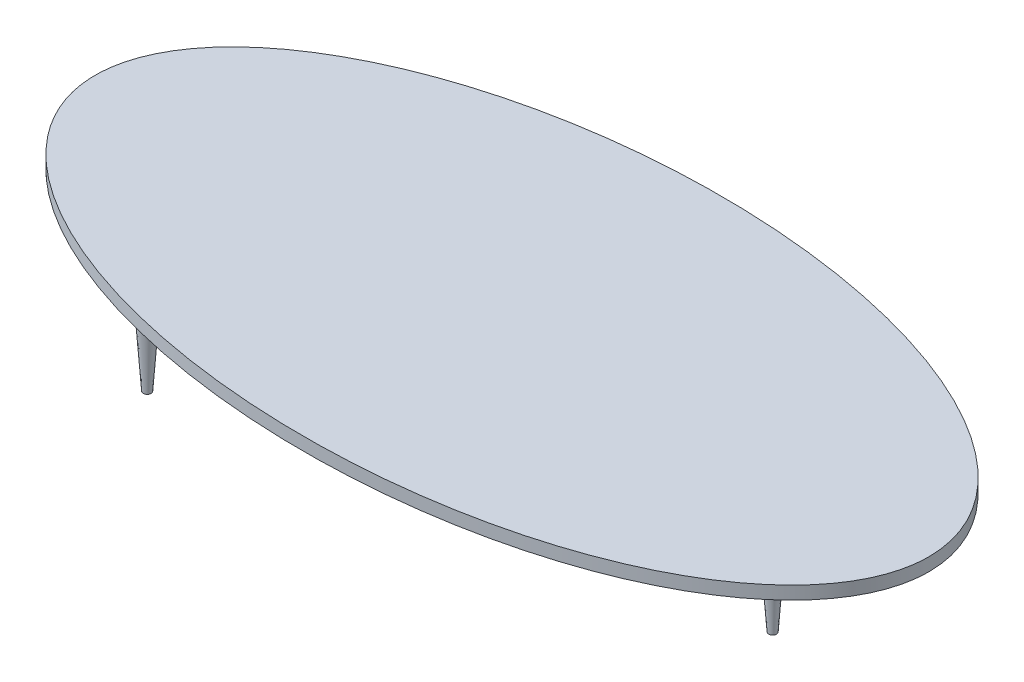
ISO-10303-21;
HEADER;
FILE_DESCRIPTION(('STEP AP214'),'2;1');
FILE_NAME('part.step','',(''),(''),'','','');
FILE_SCHEMA(('AUTOMOTIVE_DESIGN { 1 0 10303 214 1 1 1 1 }'));
ENDSEC;
DATA;
#1=APPLICATION_CONTEXT('core data for automotive mechanical design processes');
#2=APPLICATION_PROTOCOL_DEFINITION('international standard','automotive_design',2000,#1);
#3=PRODUCT_CONTEXT('',#1,'mechanical');
#4=PRODUCT('Part','Part','',(#3));
#5=PRODUCT_RELATED_PRODUCT_CATEGORY('part','',(#4));
#6=PRODUCT_DEFINITION_FORMATION('','',#4);
#7=PRODUCT_DEFINITION_CONTEXT('part definition',#1,'design');
#8=PRODUCT_DEFINITION('design','',#6,#7);
#9=PRODUCT_DEFINITION_SHAPE('','',#8);
#10=(LENGTH_UNIT() NAMED_UNIT(*) SI_UNIT(.MILLI.,.METRE.));
#11=(NAMED_UNIT(*) PLANE_ANGLE_UNIT() SI_UNIT($,.RADIAN.));
#12=(NAMED_UNIT(*) SI_UNIT($,.STERADIAN.) SOLID_ANGLE_UNIT());
#13=UNCERTAINTY_MEASURE_WITH_UNIT(LENGTH_MEASURE(1.E-05),#10,'distance_accuracy_value','');
#14=(GEOMETRIC_REPRESENTATION_CONTEXT(3) GLOBAL_UNCERTAINTY_ASSIGNED_CONTEXT((#13)) GLOBAL_UNIT_ASSIGNED_CONTEXT((#10,
#11,#12)) REPRESENTATION_CONTEXT('',''));
#15=CARTESIAN_POINT('',(0.,0.,0.));
#16=DIRECTION('',(0.,0.,1.));
#17=DIRECTION('',(1.,0.,0.));
#18=AXIS2_PLACEMENT_3D('',#15,#16,#17);
#19=CARTESIAN_POINT('',(0.,76.2,0.));
#20=DIRECTION('',(0.,1.,0.));
#21=DIRECTION('',(1.,0.,0.));
#22=AXIS2_PLACEMENT_3D('',#19,#20,#21);
#23=ELLIPSE('',#22,2438.4,1219.2);
#24=DIRECTION('',(0.,-1.,0.));
#25=VECTOR('',#24,1.);
#26=SURFACE_OF_LINEAR_EXTRUSION('',#23,#25);
#27=CARTESIAN_POINT('',(2438.4,76.2,0.));
#28=VERTEX_POINT('',#27);
#29=EDGE_CURVE('E50',#28,#28,#23,.T.);
#30=ORIENTED_EDGE('',*,*,#29,.F.);
#31=EDGE_LOOP('',(#30));
#32=FACE_BOUND('',#31,.T.);
#33=CARTESIAN_POINT('',(0.,0.,0.));
#34=DIRECTION('',(0.,1.,0.));
#35=DIRECTION('',(1.,0.,0.));
#36=AXIS2_PLACEMENT_3D('',#33,#34,#35);
#37=ELLIPSE('',#36,2438.4,1219.2);
#38=CARTESIAN_POINT('',(2438.4,0.,0.));
#39=VERTEX_POINT('',#38);
#40=EDGE_CURVE('E53',#39,#39,#37,.T.);
#41=ORIENTED_EDGE('',*,*,#40,.T.);
#42=EDGE_LOOP('',(#41));
#43=FACE_BOUND('',#42,.T.);
#44=ADVANCED_FACE('F35',(#32,#43),#26,.F.);
#45=CARTESIAN_POINT('',(0.,76.2,0.));
#46=DIRECTION('',(0.,1.,0.));
#47=DIRECTION('',(0.,0.,1.));
#48=AXIS2_PLACEMENT_3D('',#45,#46,#47);
#49=PLANE('',#48);
#50=ORIENTED_EDGE('',*,*,#29,.T.);
#51=EDGE_LOOP('',(#50));
#52=FACE_BOUND('',#51,.T.);
#53=ADVANCED_FACE('F83',(#52),#49,.T.);
#54=CARTESIAN_POINT('',(0.,0.,0.));
#55=DIRECTION('',(0.,1.,0.));
#56=DIRECTION('',(0.,0.,1.));
#57=AXIS2_PLACEMENT_3D('',#54,#55,#56);
#58=PLANE('',#57);
#59=CARTESIAN_POINT('',(1524.,0.,1.66533453693773E-13));
#60=DIRECTION('',(0.,1.,0.));
#61=DIRECTION('',(0.,0.,1.));
#62=AXIS2_PLACEMENT_3D('',#59,#60,#61);
#63=CIRCLE('',#62,76.2);
#64=CARTESIAN_POINT('',(1524.,0.,-76.1999999999998));
#65=VERTEX_POINT('',#64);
#66=EDGE_CURVE('E10',#65,#65,#63,.F.);
#67=ORIENTED_EDGE('',*,*,#66,.F.);
#68=EDGE_LOOP('',(#67));
#69=FACE_BOUND('',#68,.T.);
#70=CARTESIAN_POINT('',(-1524.,0.,-609.6));
#71=DIRECTION('',(0.,1.,0.));
#72=DIRECTION('',(0.,0.,1.));
#73=AXIS2_PLACEMENT_3D('',#70,#71,#72);
#74=CIRCLE('',#73,76.2);
#75=CARTESIAN_POINT('',(-1524.,0.,-685.8));
#76=VERTEX_POINT('',#75);
#77=EDGE_CURVE('E42',#76,#76,#74,.F.);
#78=ORIENTED_EDGE('',*,*,#77,.F.);
#79=EDGE_LOOP('',(#78));
#80=FACE_BOUND('',#79,.T.);
#81=CARTESIAN_POINT('',(-1524.,0.,609.6));
#82=DIRECTION('',(0.,1.,0.));
#83=DIRECTION('',(0.,0.,1.));
#84=AXIS2_PLACEMENT_3D('',#81,#82,#83);
#85=CIRCLE('',#84,76.2);
#86=CARTESIAN_POINT('',(-1524.,0.,533.4));
#87=VERTEX_POINT('',#86);
#88=EDGE_CURVE('E46',#87,#87,#85,.F.);
#89=ORIENTED_EDGE('',*,*,#88,.F.);
#90=EDGE_LOOP('',(#89));
#91=FACE_BOUND('',#90,.T.);
#92=ORIENTED_EDGE('',*,*,#40,.F.);
#93=EDGE_LOOP('',(#92));
#94=FACE_BOUND('',#93,.T.);
#95=ADVANCED_FACE('F88',(#69,#80,#91,#94),#58,.F.);
#96=CARTESIAN_POINT('',(-1524.,0.,609.6));
#97=DIRECTION('',(0.,1.,0.));
#98=DIRECTION('',(0.,0.,-1.));
#99=AXIS2_PLACEMENT_3D('',#96,#97,#98);
#100=CONICAL_SURFACE('',#99,76.2,0.0698131700797732);
#101=CARTESIAN_POINT('',(-1524.,-762.,609.6));
#102=DIRECTION('',(0.,-1.,0.));
#103=DIRECTION('',(0.,0.,-1.));
#104=AXIS2_PLACEMENT_3D('',#101,#102,#103);
#105=CIRCLE('',#104,22.915769299045);
#106=CARTESIAN_POINT('',(-1524.,-762.,586.684230700955));
#107=VERTEX_POINT('',#106);
#108=EDGE_CURVE('E55',#107,#107,#105,.T.);
#109=CARTESIAN_POINT('',(-1524.,-762.,586.684230700955));
#110=CARTESIAN_POINT('',(-1524.,-754.0625,586.129186631153));
#111=CARTESIAN_POINT('',(-1524.,-746.125,585.574142561352));
#112=CARTESIAN_POINT('',(-1524.,-730.25,584.464054421748));
#113=CARTESIAN_POINT('',(-1524.,-722.3125,583.909010351947));
#114=CARTESIAN_POINT('',(-1524.,-706.4375,582.798922212344));
#115=CARTESIAN_POINT('',(-1524.,-698.5,582.243878142542));
#116=CARTESIAN_POINT('',(-1524.,-682.625,581.133790002939));
#117=CARTESIAN_POINT('',(-1524.,-674.6875,580.578745933137));
#118=CARTESIAN_POINT('',(-1524.,-658.8125,579.468657793534));
#119=CARTESIAN_POINT('',(-1524.,-650.875,578.913613723732));
#120=CARTESIAN_POINT('',(-1524.,-635.,577.803525584129));
#121=CARTESIAN_POINT('',(-1524.,-627.0625,577.248481514327));
#122=CARTESIAN_POINT('',(-1524.,-611.1875,576.138393374724));
#123=CARTESIAN_POINT('',(-1524.,-603.25,575.583349304923));
#124=CARTESIAN_POINT('',(-1524.,-587.375,574.473261165319));
#125=CARTESIAN_POINT('',(-1524.,-579.4375,573.918217095518));
#126=CARTESIAN_POINT('',(-1524.,-563.5625,572.808128955915));
#127=CARTESIAN_POINT('',(-1524.,-555.625,572.253084886113));
#128=CARTESIAN_POINT('',(-1524.,-539.75,571.14299674651));
#129=CARTESIAN_POINT('',(-1524.,-531.8125,570.587952676708));
#130=CARTESIAN_POINT('',(-1524.,-515.9375,569.477864537105));
#131=CARTESIAN_POINT('',(-1524.,-508.,568.922820467303));
#132=CARTESIAN_POINT('',(-1524.,-492.125,567.8127323277));
#133=CARTESIAN_POINT('',(-1524.,-484.1875,567.257688257898));
#134=CARTESIAN_POINT('',(-1524.,-468.3125,566.147600118295));
#135=CARTESIAN_POINT('',(-1524.,-460.375,565.592556048494));
#136=CARTESIAN_POINT('',(-1524.,-444.5,564.48246790889));
#137=CARTESIAN_POINT('',(-1524.,-436.5625,563.927423839089));
#138=CARTESIAN_POINT('',(-1524.,-420.6875,562.817335699485));
#139=CARTESIAN_POINT('',(-1524.,-412.75,562.262291629684));
#140=CARTESIAN_POINT('',(-1524.,-396.875,561.152203490081));
#141=CARTESIAN_POINT('',(-1524.,-388.9375,560.597159420279));
#142=CARTESIAN_POINT('',(-1524.,-373.0625,559.487071280676));
#143=CARTESIAN_POINT('',(-1524.,-365.125,558.932027210874));
#144=CARTESIAN_POINT('',(-1524.,-349.25,557.821939071271));
#145=CARTESIAN_POINT('',(-1524.,-341.3125,557.266895001469));
#146=CARTESIAN_POINT('',(-1524.,-325.4375,556.156806861866));
#147=CARTESIAN_POINT('',(-1524.,-317.5,555.601762792065));
#148=CARTESIAN_POINT('',(-1524.,-301.625,554.491674652461));
#149=CARTESIAN_POINT('',(-1524.,-293.6875,553.93663058266));
#150=CARTESIAN_POINT('',(-1524.,-277.8125,552.826542443056));
#151=CARTESIAN_POINT('',(-1524.,-269.875,552.271498373255));
#152=CARTESIAN_POINT('',(-1524.,-254.,551.161410233652));
#153=CARTESIAN_POINT('',(-1524.,-246.0625,550.60636616385));
#154=CARTESIAN_POINT('',(-1524.,-230.1875,549.496278024247));
#155=CARTESIAN_POINT('',(-1524.,-222.25,548.941233954445));
#156=CARTESIAN_POINT('',(-1524.,-206.375,547.831145814842));
#157=CARTESIAN_POINT('',(-1524.,-198.4375,547.27610174504));
#158=CARTESIAN_POINT('',(-1524.,-182.5625,546.166013605437));
#159=CARTESIAN_POINT('',(-1524.,-174.625,545.610969535635));
#160=CARTESIAN_POINT('',(-1524.,-158.75,544.500881396032));
#161=CARTESIAN_POINT('',(-1524.,-150.8125,543.945837326231));
#162=CARTESIAN_POINT('',(-1524.,-134.9375,542.835749186627));
#163=CARTESIAN_POINT('',(-1524.,-127.,542.280705116826));
#164=CARTESIAN_POINT('',(-1524.,-111.125,541.170616977223));
#165=CARTESIAN_POINT('',(-1524.,-103.1875,540.615572907421));
#166=CARTESIAN_POINT('',(-1524.,-87.3125000000001,539.505484767818));
#167=CARTESIAN_POINT('',(-1524.,-79.3750000000001,538.950440698016));
#168=CARTESIAN_POINT('',(-1524.,-63.5,537.840352558413));
#169=CARTESIAN_POINT('',(-1524.,-55.5625,537.285308488611));
#170=CARTESIAN_POINT('',(-1524.,-39.6875,536.175220349008));
#171=CARTESIAN_POINT('',(-1524.,-31.75,535.620176279206));
#172=CARTESIAN_POINT('',(-1524.,-15.875,534.510088139603));
#173=CARTESIAN_POINT('',(-1524.,-7.9375,533.955044069801));
#174=CARTESIAN_POINT('',(-1524.,0.,533.4));
#175=B_SPLINE_CURVE_WITH_KNOTS('',3,(#109,#110,#111,#112,#113,#114,#115,#116,#117,#118,#119,
#120,#121,#122,#123,#124,#125,#126,#127,#128,#129,#130,#131,#132,#133,#134,#135,#136,#137,#138,
#139,#140,#141,#142,#143,#144,#145,#146,#147,#148,#149,#150,#151,#152,#153,#154,#155,#156,#157,
#158,#159,#160,#161,#162,#163,#164,#165,#166,#167,#168,#169,#170,#171,#172,#173,#174),
.UNSPECIFIED.,.F.,.F.,(4,2,2,2,2,2,2,2,2,2,2,2,2,2,2,2,2,2,2,2,2,2,2,2,2,2,2,2,2,2,2,2,4),(0.,
23.8706476980579,47.7412953961159,71.6119430941738,95.4825907922317,119.35323849029,
143.223886188347,167.094533886405,190.965181584463,214.835829282521,238.706476980579,
262.577124678637,286.447772376695,310.318420074753,334.189067772811,358.059715470869,
381.930363168927,405.801010866984,429.671658565042,453.5423062631,477.412953961158,
501.283601659216,525.154249357274,549.024897055332,572.89554475339,596.766192451448,
620.636840149506,644.507487847564,668.378135545621,692.248783243679,716.119430941737,
739.990078639795,763.860726337853),.UNSPECIFIED.);
#176=EDGE_CURVE('BSEAM96',#107,#87,#175,.T.);
#177=ORIENTED_EDGE('',*,*,#108,.F.);
#178=ORIENTED_EDGE('',*,*,#88,.T.);
#179=ORIENTED_EDGE('',*,*,#176,.T.);
#180=ORIENTED_EDGE('',*,*,#176,.F.);
#181=EDGE_LOOP('',(#177,#179,#178,#180));
#182=FACE_BOUND('',#181,.T.);
#183=ADVANCED_FACE('F96',(#182),#100,.T.);
#184=CARTESIAN_POINT('',(-1524.,-762.,609.6));
#185=DIRECTION('',(0.,-1.,0.));
#186=DIRECTION('',(0.,0.,-1.));
#187=AXIS2_PLACEMENT_3D('',#184,#185,#186);
#188=PLANE('',#187);
#189=ORIENTED_EDGE('',*,*,#108,.T.);
#190=EDGE_LOOP('',(#189));
#191=FACE_BOUND('',#190,.T.);
#192=ADVANCED_FACE('F101',(#191),#188,.T.);
#193=CARTESIAN_POINT('',(-1524.,0.,-609.6));
#194=DIRECTION('',(0.,1.,0.));
#195=DIRECTION('',(0.,0.,-1.));
#196=AXIS2_PLACEMENT_3D('',#193,#194,#195);
#197=CONICAL_SURFACE('',#196,76.2,0.0698131700797732);
#198=CARTESIAN_POINT('',(-1524.,-762.,-609.6));
#199=DIRECTION('',(0.,-1.,0.));
#200=DIRECTION('',(0.,0.,-1.));
#201=AXIS2_PLACEMENT_3D('',#198,#199,#200);
#202=CIRCLE('',#201,22.915769299045);
#203=CARTESIAN_POINT('',(-1524.,-762.,-632.515769299045));
#204=VERTEX_POINT('',#203);
#205=EDGE_CURVE('E61',#204,#204,#202,.T.);
#206=CARTESIAN_POINT('',(-1524.,-762.,-632.515769299045));
#207=CARTESIAN_POINT('',(-1524.,-754.0625,-633.070813368847));
#208=CARTESIAN_POINT('',(-1524.,-746.125,-633.625857438648));
#209=CARTESIAN_POINT('',(-1524.,-730.25,-634.735945578252));
#210=CARTESIAN_POINT('',(-1524.,-722.3125,-635.290989648053));
#211=CARTESIAN_POINT('',(-1524.,-706.4375,-636.401077787657));
#212=CARTESIAN_POINT('',(-1524.,-698.5,-636.956121857458));
#213=CARTESIAN_POINT('',(-1524.,-682.625,-638.066209997061));
#214=CARTESIAN_POINT('',(-1524.,-674.6875,-638.621254066863));
#215=CARTESIAN_POINT('',(-1524.,-658.8125,-639.731342206466));
#216=CARTESIAN_POINT('',(-1524.,-650.875,-640.286386276268));
#217=CARTESIAN_POINT('',(-1524.,-635.,-641.396474415871));
#218=CARTESIAN_POINT('',(-1524.,-627.0625,-641.951518485673));
#219=CARTESIAN_POINT('',(-1524.,-611.1875,-643.061606625276));
#220=CARTESIAN_POINT('',(-1524.,-603.25,-643.616650695078));
#221=CARTESIAN_POINT('',(-1524.,-587.375,-644.726738834681));
#222=CARTESIAN_POINT('',(-1524.,-579.4375,-645.281782904482));
#223=CARTESIAN_POINT('',(-1524.,-563.5625,-646.391871044086));
#224=CARTESIAN_POINT('',(-1524.,-555.625,-646.946915113887));
#225=CARTESIAN_POINT('',(-1524.,-539.75,-648.057003253491));
#226=CARTESIAN_POINT('',(-1524.,-531.8125,-648.612047323292));
#227=CARTESIAN_POINT('',(-1524.,-515.9375,-649.722135462895));
#228=CARTESIAN_POINT('',(-1524.,-508.,-650.277179532697));
#229=CARTESIAN_POINT('',(-1524.,-492.125,-651.3872676723));
#230=CARTESIAN_POINT('',(-1524.,-484.1875,-651.942311742102));
#231=CARTESIAN_POINT('',(-1524.,-468.3125,-653.052399881705));
#232=CARTESIAN_POINT('',(-1524.,-460.375,-653.607443951507));
#233=CARTESIAN_POINT('',(-1524.,-444.5,-654.71753209111));
#234=CARTESIAN_POINT('',(-1524.,-436.5625,-655.272576160912));
#235=CARTESIAN_POINT('',(-1524.,-420.6875,-656.382664300515));
#236=CARTESIAN_POINT('',(-1524.,-412.75,-656.937708370316));
#237=CARTESIAN_POINT('',(-1524.,-396.875,-658.04779650992));
#238=CARTESIAN_POINT('',(-1524.,-388.9375,-658.602840579721));
#239=CARTESIAN_POINT('',(-1524.,-373.0625,-659.712928719325));
#240=CARTESIAN_POINT('',(-1524.,-365.125,-660.267972789126));
#241=CARTESIAN_POINT('',(-1524.,-349.25,-661.378060928729));
#242=CARTESIAN_POINT('',(-1524.,-341.3125,-661.933104998531));
#243=CARTESIAN_POINT('',(-1524.,-325.4375,-663.043193138134));
#244=CARTESIAN_POINT('',(-1524.,-317.5,-663.598237207936));
#245=CARTESIAN_POINT('',(-1524.,-301.625,-664.708325347539));
#246=CARTESIAN_POINT('',(-1524.,-293.6875,-665.263369417341));
#247=CARTESIAN_POINT('',(-1524.,-277.8125,-666.373457556944));
#248=CARTESIAN_POINT('',(-1524.,-269.875,-666.928501626746));
#249=CARTESIAN_POINT('',(-1524.,-254.,-668.038589766349));
#250=CARTESIAN_POINT('',(-1524.,-246.0625,-668.59363383615));
#251=CARTESIAN_POINT('',(-1524.,-230.1875,-669.703721975754));
#252=CARTESIAN_POINT('',(-1524.,-222.25,-670.258766045555));
#253=CARTESIAN_POINT('',(-1524.,-206.375,-671.368854185158));
#254=CARTESIAN_POINT('',(-1524.,-198.4375,-671.92389825496));
#255=CARTESIAN_POINT('',(-1524.,-182.5625,-673.033986394563));
#256=CARTESIAN_POINT('',(-1524.,-174.625,-673.589030464365));
#257=CARTESIAN_POINT('',(-1524.,-158.75,-674.699118603968));
#258=CARTESIAN_POINT('',(-1524.,-150.8125,-675.25416267377));
#259=CARTESIAN_POINT('',(-1524.,-134.9375,-676.364250813373));
#260=CARTESIAN_POINT('',(-1524.,-127.,-676.919294883175));
#261=CARTESIAN_POINT('',(-1524.,-111.125,-678.029383022778));
#262=CARTESIAN_POINT('',(-1524.,-103.1875,-678.584427092579));
#263=CARTESIAN_POINT('',(-1524.,-87.3125000000001,-679.694515232183));
#264=CARTESIAN_POINT('',(-1524.,-79.3750000000001,-680.249559301984));
#265=CARTESIAN_POINT('',(-1524.,-63.5,-681.359647441588));
#266=CARTESIAN_POINT('',(-1524.,-55.5625,-681.914691511389));
#267=CARTESIAN_POINT('',(-1524.,-39.6875,-683.024779650992));
#268=CARTESIAN_POINT('',(-1524.,-31.75,-683.579823720794));
#269=CARTESIAN_POINT('',(-1524.,-15.875,-684.689911860397));
#270=CARTESIAN_POINT('',(-1524.,-7.9375,-685.244955930199));
#271=CARTESIAN_POINT('',(-1524.,0.,-685.8));
#272=B_SPLINE_CURVE_WITH_KNOTS('',3,(#206,#207,#208,#209,#210,#211,#212,#213,#214,#215,#216,
#217,#218,#219,#220,#221,#222,#223,#224,#225,#226,#227,#228,#229,#230,#231,#232,#233,#234,#235,
#236,#237,#238,#239,#240,#241,#242,#243,#244,#245,#246,#247,#248,#249,#250,#251,#252,#253,#254,
#255,#256,#257,#258,#259,#260,#261,#262,#263,#264,#265,#266,#267,#268,#269,#270,#271),
.UNSPECIFIED.,.F.,.F.,(4,2,2,2,2,2,2,2,2,2,2,2,2,2,2,2,2,2,2,2,2,2,2,2,2,2,2,2,2,2,2,2,4),(0.,
23.8706476980579,47.7412953961159,71.6119430941738,95.4825907922317,119.35323849029,
143.223886188347,167.094533886405,190.965181584463,214.835829282521,238.706476980579,
262.577124678637,286.447772376695,310.318420074753,334.189067772811,358.059715470869,
381.930363168927,405.801010866984,429.671658565042,453.5423062631,477.412953961158,
501.283601659216,525.154249357274,549.024897055332,572.89554475339,596.766192451448,
620.636840149506,644.507487847564,668.378135545621,692.248783243679,716.119430941737,
739.990078639795,763.860726337853),.UNSPECIFIED.);
#273=EDGE_CURVE('BSEAM79',#204,#76,#272,.T.);
#274=ORIENTED_EDGE('',*,*,#205,.F.);
#275=ORIENTED_EDGE('',*,*,#77,.T.);
#276=ORIENTED_EDGE('',*,*,#273,.T.);
#277=ORIENTED_EDGE('',*,*,#273,.F.);
#278=EDGE_LOOP('',(#274,#276,#275,#277));
#279=FACE_BOUND('',#278,.T.);
#280=ADVANCED_FACE('F79',(#279),#197,.T.);
#281=CARTESIAN_POINT('',(-1524.,-762.,-609.6));
#282=DIRECTION('',(0.,-1.,0.));
#283=DIRECTION('',(0.,0.,-1.));
#284=AXIS2_PLACEMENT_3D('',#281,#282,#283);
#285=PLANE('',#284);
#286=ORIENTED_EDGE('',*,*,#205,.T.);
#287=EDGE_LOOP('',(#286));
#288=FACE_BOUND('',#287,.T.);
#289=ADVANCED_FACE('F72',(#288),#285,.T.);
#290=CARTESIAN_POINT('',(1524.,0.,1.66533453693773E-13));
#291=DIRECTION('',(0.,1.,0.));
#292=DIRECTION('',(0.,0.,-1.));
#293=AXIS2_PLACEMENT_3D('',#290,#291,#292);
#294=CONICAL_SURFACE('',#293,76.2,0.0698131700797732);
#295=CARTESIAN_POINT('',(1524.,-762.,1.66533453693773E-13));
#296=DIRECTION('',(0.,-1.,0.));
#297=DIRECTION('',(0.,0.,-1.));
#298=AXIS2_PLACEMENT_3D('',#295,#296,#297);
#299=CIRCLE('',#298,22.915769299045);
#300=CARTESIAN_POINT('',(1524.,-762.,-22.9157692990448));
#301=VERTEX_POINT('',#300);
#302=EDGE_CURVE('E64',#301,#301,#299,.T.);
#303=CARTESIAN_POINT('',(1524.,-762.,-22.9157692990448));
#304=CARTESIAN_POINT('',(1524.,-754.0625,-23.4708133688464));
#305=CARTESIAN_POINT('',(1524.,-746.125,-24.0258574386481));
#306=CARTESIAN_POINT('',(1524.,-730.25,-25.1359455782513));
#307=CARTESIAN_POINT('',(1524.,-722.3125,-25.6909896480529));
#308=CARTESIAN_POINT('',(1524.,-706.4375,-26.8010777876561));
#309=CARTESIAN_POINT('',(1524.,-698.5,-27.3561218574577));
#310=CARTESIAN_POINT('',(1524.,-682.625,-28.466209997061));
#311=CARTESIAN_POINT('',(1524.,-674.6875,-29.0212540668626));
#312=CARTESIAN_POINT('',(1524.,-658.8125,-30.1313422064658));
#313=CARTESIAN_POINT('',(1524.,-650.875,-30.6863862762674));
#314=CARTESIAN_POINT('',(1524.,-635.,-31.7964744158706));
#315=CARTESIAN_POINT('',(1524.,-627.0625,-32.3515184856723));
#316=CARTESIAN_POINT('',(1524.,-611.1875,-33.4616066252755));
#317=CARTESIAN_POINT('',(1524.,-603.25,-34.0166506950771));
#318=CARTESIAN_POINT('',(1524.,-587.375,-35.1267388346803));
#319=CARTESIAN_POINT('',(1524.,-579.4375,-35.681782904482));
#320=CARTESIAN_POINT('',(1524.,-563.5625,-36.7918710440852));
#321=CARTESIAN_POINT('',(1524.,-555.625,-37.3469151138868));
#322=CARTESIAN_POINT('',(1524.,-539.75,-38.45700325349));
#323=CARTESIAN_POINT('',(1524.,-531.8125,-39.0120473232916));
#324=CARTESIAN_POINT('',(1524.,-515.9375,-40.1221354628949));
#325=CARTESIAN_POINT('',(1524.,-508.,-40.6771795326965));
#326=CARTESIAN_POINT('',(1524.,-492.125,-41.7872676722997));
#327=CARTESIAN_POINT('',(1524.,-484.1875,-42.3423117421013));
#328=CARTESIAN_POINT('',(1524.,-468.3125,-43.4523998817046));
#329=CARTESIAN_POINT('',(1524.,-460.375,-44.0074439515062));
#330=CARTESIAN_POINT('',(1524.,-444.5,-45.1175320911094));
#331=CARTESIAN_POINT('',(1524.,-436.5625,-45.672576160911));
#332=CARTESIAN_POINT('',(1524.,-420.6875,-46.7826643005142));
#333=CARTESIAN_POINT('',(1524.,-412.75,-47.3377083703159));
#334=CARTESIAN_POINT('',(1524.,-396.875,-48.4477965099191));
#335=CARTESIAN_POINT('',(1524.,-388.9375,-49.0028405797207));
#336=CARTESIAN_POINT('',(1524.,-373.0625,-50.1129287193239));
#337=CARTESIAN_POINT('',(1524.,-365.125,-50.6679727891255));
#338=CARTESIAN_POINT('',(1524.,-349.25,-51.7780609287288));
#339=CARTESIAN_POINT('',(1524.,-341.3125,-52.3331049985304));
#340=CARTESIAN_POINT('',(1524.,-325.4375,-53.4431931381336));
#341=CARTESIAN_POINT('',(1524.,-317.5,-53.9982372079352));
#342=CARTESIAN_POINT('',(1524.,-301.625,-55.1083253475385));
#343=CARTESIAN_POINT('',(1524.,-293.6875,-55.6633694173401));
#344=CARTESIAN_POINT('',(1524.,-277.8125,-56.7734575569433));
#345=CARTESIAN_POINT('',(1524.,-269.875,-57.3285016267449));
#346=CARTESIAN_POINT('',(1524.,-254.,-58.4385897663481));
#347=CARTESIAN_POINT('',(1524.,-246.0625,-58.9936338361497));
#348=CARTESIAN_POINT('',(1524.,-230.1875,-60.103721975753));
#349=CARTESIAN_POINT('',(1524.,-222.25,-60.6587660455546));
#350=CARTESIAN_POINT('',(1524.,-206.375,-61.7688541851578));
#351=CARTESIAN_POINT('',(1524.,-198.4375,-62.3238982549594));
#352=CARTESIAN_POINT('',(1524.,-182.5625,-63.4339863945627));
#353=CARTESIAN_POINT('',(1524.,-174.625,-63.9890304643643));
#354=CARTESIAN_POINT('',(1524.,-158.75,-65.0991186039675));
#355=CARTESIAN_POINT('',(1524.,-150.8125,-65.6541626737691));
#356=CARTESIAN_POINT('',(1524.,-134.9375,-66.7642508133724));
#357=CARTESIAN_POINT('',(1524.,-127.,-67.319294883174));
#358=CARTESIAN_POINT('',(1524.,-111.125,-68.4293830227772));
#359=CARTESIAN_POINT('',(1524.,-103.1875,-68.9844270925788));
#360=CARTESIAN_POINT('',(1524.,-87.3125000000001,-70.094515232182));
#361=CARTESIAN_POINT('',(1524.,-79.375,-70.6495593019836));
#362=CARTESIAN_POINT('',(1524.,-63.5,-71.7596474415869));
#363=CARTESIAN_POINT('',(1524.,-55.5625,-72.3146915113885));
#364=CARTESIAN_POINT('',(1524.,-39.6875,-73.4247796509917));
#365=CARTESIAN_POINT('',(1524.,-31.75,-73.9798237207933));
#366=CARTESIAN_POINT('',(1524.,-15.875,-75.0899118603966));
#367=CARTESIAN_POINT('',(1524.,-7.93750000000001,-75.6449559301982));
#368=CARTESIAN_POINT('',(1524.,0.,-76.1999999999998));
#369=B_SPLINE_CURVE_WITH_KNOTS('',3,(#303,#304,#305,#306,#307,#308,#309,#310,#311,#312,#313,
#314,#315,#316,#317,#318,#319,#320,#321,#322,#323,#324,#325,#326,#327,#328,#329,#330,#331,#332,
#333,#334,#335,#336,#337,#338,#339,#340,#341,#342,#343,#344,#345,#346,#347,#348,#349,#350,#351,
#352,#353,#354,#355,#356,#357,#358,#359,#360,#361,#362,#363,#364,#365,#366,#367,#368),
.UNSPECIFIED.,.F.,.F.,(4,2,2,2,2,2,2,2,2,2,2,2,2,2,2,2,2,2,2,2,2,2,2,2,2,2,2,2,2,2,2,2,4),(0.,
23.8706476980579,47.7412953961159,71.6119430941738,95.4825907922317,119.35323849029,
143.223886188347,167.094533886405,190.965181584463,214.835829282521,238.706476980579,
262.577124678637,286.447772376695,310.318420074753,334.189067772811,358.059715470869,
381.930363168926,405.801010866984,429.671658565042,453.5423062631,477.412953961158,
501.283601659216,525.154249357274,549.024897055332,572.89554475339,596.766192451448,
620.636840149505,644.507487847563,668.378135545621,692.248783243679,716.119430941737,
739.990078639795,763.860726337853),.UNSPECIFIED.);
#370=EDGE_CURVE('BSEAM70',#301,#65,#369,.T.);
#371=ORIENTED_EDGE('',*,*,#302,.F.);
#372=ORIENTED_EDGE('',*,*,#66,.T.);
#373=ORIENTED_EDGE('',*,*,#370,.T.);
#374=ORIENTED_EDGE('',*,*,#370,.F.);
#375=EDGE_LOOP('',(#371,#373,#372,#374));
#376=FACE_BOUND('',#375,.T.);
#377=ADVANCED_FACE('F70',(#376),#294,.T.);
#378=CARTESIAN_POINT('',(1524.,-762.,1.66533453693773E-13));
#379=DIRECTION('',(0.,-1.,0.));
#380=DIRECTION('',(0.,0.,-1.));
#381=AXIS2_PLACEMENT_3D('',#378,#379,#380);
#382=PLANE('',#381);
#383=ORIENTED_EDGE('',*,*,#302,.T.);
#384=EDGE_LOOP('',(#383));
#385=FACE_BOUND('',#384,.T.);
#386=ADVANCED_FACE('F68',(#385),#382,.T.);
#387=CLOSED_SHELL('',(#44,#53,#95,#183,#192,#280,#289,#377,#386));
#388=MANIFOLD_SOLID_BREP('B2',#387);
#389=ADVANCED_BREP_SHAPE_REPRESENTATION('',(#18,#388),#14);
#390=SHAPE_DEFINITION_REPRESENTATION(#9,#389);
ENDSEC;
END-ISO-10303-21;
